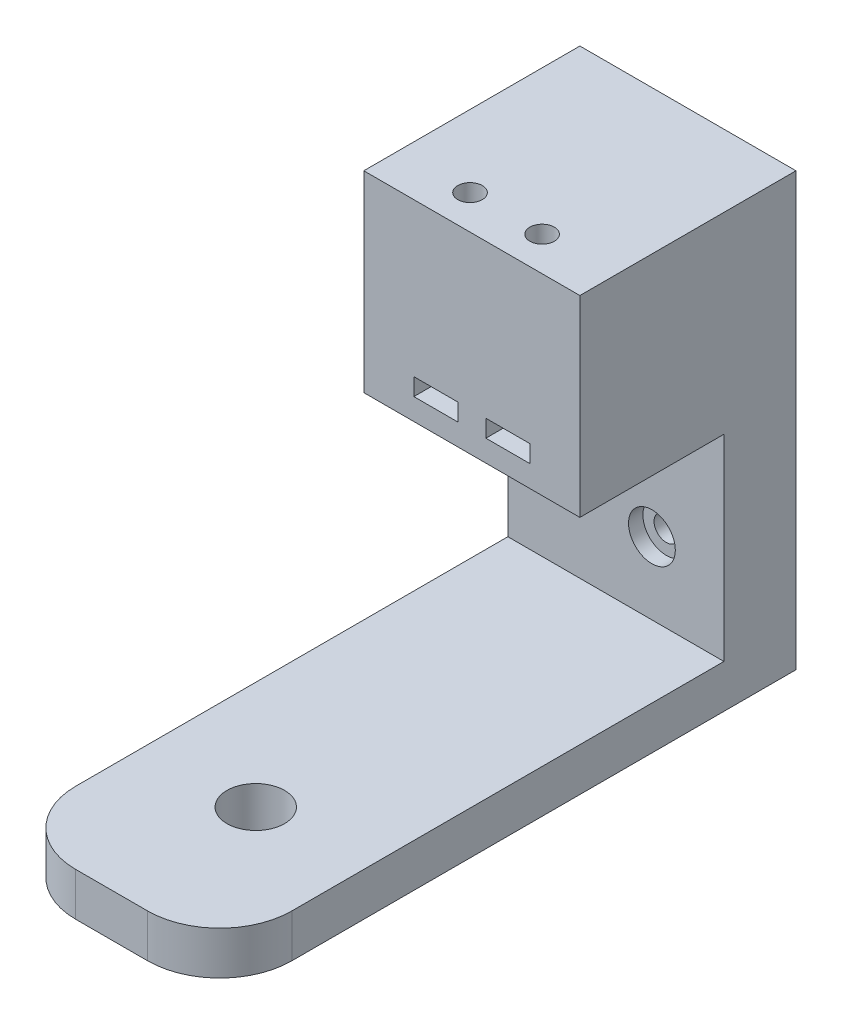
ISO-10303-21;
HEADER;
FILE_DESCRIPTION(('STEP AP214'),'2;1');
FILE_NAME('part.step','',(''),(''),'','','');
FILE_SCHEMA(('AUTOMOTIVE_DESIGN { 1 0 10303 214 1 1 1 1 }'));
ENDSEC;
DATA;
#1=APPLICATION_CONTEXT('core data for automotive mechanical design processes');
#2=APPLICATION_PROTOCOL_DEFINITION('international standard','automotive_design',2000,#1);
#3=PRODUCT_CONTEXT('',#1,'mechanical');
#4=PRODUCT('Part','Part','',(#3));
#5=PRODUCT_RELATED_PRODUCT_CATEGORY('part','',(#4));
#6=PRODUCT_DEFINITION_FORMATION('','',#4);
#7=PRODUCT_DEFINITION_CONTEXT('part definition',#1,'design');
#8=PRODUCT_DEFINITION('design','',#6,#7);
#9=PRODUCT_DEFINITION_SHAPE('','',#8);
#10=(LENGTH_UNIT() NAMED_UNIT(*) SI_UNIT(.MILLI.,.METRE.));
#11=(NAMED_UNIT(*) PLANE_ANGLE_UNIT() SI_UNIT($,.RADIAN.));
#12=(NAMED_UNIT(*) SI_UNIT($,.STERADIAN.) SOLID_ANGLE_UNIT());
#13=UNCERTAINTY_MEASURE_WITH_UNIT(LENGTH_MEASURE(1.E-05),#10,'distance_accuracy_value','');
#14=(GEOMETRIC_REPRESENTATION_CONTEXT(3) GLOBAL_UNCERTAINTY_ASSIGNED_CONTEXT((#13)) GLOBAL_UNIT_ASSIGNED_CONTEXT((#10,
#11,#12)) REPRESENTATION_CONTEXT('',''));
#15=CARTESIAN_POINT('',(0.,0.,0.));
#16=DIRECTION('',(0.,0.,1.));
#17=DIRECTION('',(1.,0.,0.));
#18=AXIS2_PLACEMENT_3D('',#15,#16,#17);
#19=CARTESIAN_POINT('',(20.,33.32,25.25));
#20=DIRECTION('',(0.,-1.,0.));
#21=DIRECTION('',(0.,0.,-1.));
#22=AXIS2_PLACEMENT_3D('',#19,#20,#21);
#23=CYLINDRICAL_SURFACE('',#22,1.7);
#24=CARTESIAN_POINT('',(20.,36.32,25.25));
#25=DIRECTION('',(0.,-1.,0.));
#26=DIRECTION('',(0.,0.,-1.));
#27=AXIS2_PLACEMENT_3D('',#24,#25,#26);
#28=CIRCLE('',#27,1.7);
#29=CARTESIAN_POINT('',(20.,36.32,23.55));
#30=VERTEX_POINT('',#29);
#31=EDGE_CURVE('E42',#30,#30,#28,.F.);
#32=ORIENTED_EDGE('',*,*,#31,.T.);
#33=EDGE_LOOP('',(#32));
#34=FACE_BOUND('',#33,.T.);
#35=CARTESIAN_POINT('',(20.,33.32,25.25));
#36=DIRECTION('',(0.,-1.,0.));
#37=DIRECTION('',(0.,0.,-1.));
#38=AXIS2_PLACEMENT_3D('',#35,#36,#37);
#39=CIRCLE('',#38,1.7);
#40=CARTESIAN_POINT('',(20.,33.32,23.55));
#41=VERTEX_POINT('',#40);
#42=EDGE_CURVE('E296',#41,#41,#39,.T.);
#43=ORIENTED_EDGE('',*,*,#42,.T.);
#44=EDGE_LOOP('',(#43));
#45=FACE_BOUND('',#44,.T.);
#46=ADVANCED_FACE('F38',(#34,#45),#23,.F.);
#47=CARTESIAN_POINT('',(10.,33.32,25.25));
#48=DIRECTION('',(0.,-1.,0.));
#49=DIRECTION('',(0.,0.,-1.));
#50=AXIS2_PLACEMENT_3D('',#47,#48,#49);
#51=CYLINDRICAL_SURFACE('',#50,1.7);
#52=CARTESIAN_POINT('',(10.,38.72,25.25));
#53=DIRECTION('',(0.,1.,0.));
#54=DIRECTION('',(0.,0.,1.));
#55=AXIS2_PLACEMENT_3D('',#52,#53,#54);
#56=CIRCLE('',#55,1.7);
#57=CARTESIAN_POINT('',(10.,38.72,26.95));
#58=VERTEX_POINT('',#57);
#59=EDGE_CURVE('E419',#58,#58,#56,.F.);
#60=ORIENTED_EDGE('',*,*,#59,.T.);
#61=EDGE_LOOP('',(#60));
#62=FACE_BOUND('',#61,.T.);
#63=CARTESIAN_POINT('',(10.,60.,25.25));
#64=DIRECTION('',(0.,-1.,0.));
#65=DIRECTION('',(0.,0.,-1.));
#66=AXIS2_PLACEMENT_3D('',#63,#64,#65);
#67=CIRCLE('',#66,1.7);
#68=CARTESIAN_POINT('',(10.,60.,23.55));
#69=VERTEX_POINT('',#68);
#70=EDGE_CURVE('E292',#69,#69,#67,.F.);
#71=ORIENTED_EDGE('',*,*,#70,.T.);
#72=EDGE_LOOP('',(#71));
#73=FACE_BOUND('',#72,.T.);
#74=ADVANCED_FACE('F450',(#62,#73),#51,.F.);
#75=CARTESIAN_POINT('',(0.,0.,0.));
#76=DIRECTION('',(0.,0.,-1.));
#77=DIRECTION('',(-1.,0.,0.));
#78=AXIS2_PLACEMENT_3D('',#75,#76,#77);
#79=PLANE('',#78);
#80=CARTESIAN_POINT('',(20.,16.,0.));
#81=DIRECTION('',(0.,0.,-1.));
#82=DIRECTION('',(-1.,0.,0.));
#83=AXIS2_PLACEMENT_3D('',#80,#81,#82);
#84=CIRCLE('',#83,1.7);
#85=CARTESIAN_POINT('',(18.3,16.,0.));
#86=VERTEX_POINT('',#85);
#87=EDGE_CURVE('E281',#86,#86,#84,.F.);
#88=ORIENTED_EDGE('',*,*,#87,.T.);
#89=EDGE_LOOP('',(#88));
#90=FACE_BOUND('',#89,.T.);
#91=DIRECTION('',(0.,-1.,0.));
#92=VECTOR('',#91,1.);
#93=CARTESIAN_POINT('',(0.,0.,0.));
#94=LINE('',#93,#92);
#95=CARTESIAN_POINT('',(0.,60.,0.));
#96=VERTEX_POINT('',#95);
#97=CARTESIAN_POINT('',(0.,0.,0.));
#98=VERTEX_POINT('',#97);
#99=EDGE_CURVE('E359',#96,#98,#94,.T.);
#100=ORIENTED_EDGE('',*,*,#99,.F.);
#101=DIRECTION('',(-1.,0.,0.));
#102=VECTOR('',#101,1.);
#103=CARTESIAN_POINT('',(0.,60.,0.));
#104=LINE('',#103,#102);
#105=CARTESIAN_POINT('',(30.,60.,0.));
#106=VERTEX_POINT('',#105);
#107=EDGE_CURVE('E365',#106,#96,#104,.T.);
#108=ORIENTED_EDGE('',*,*,#107,.F.);
#109=DIRECTION('',(0.,1.,0.));
#110=VECTOR('',#109,1.);
#111=CARTESIAN_POINT('',(30.,0.,0.));
#112=LINE('',#111,#110);
#113=CARTESIAN_POINT('',(30.,0.,0.));
#114=VERTEX_POINT('',#113);
#115=EDGE_CURVE('E376',#114,#106,#112,.T.);
#116=ORIENTED_EDGE('',*,*,#115,.F.);
#117=DIRECTION('',(1.,0.,0.));
#118=VECTOR('',#117,1.);
#119=CARTESIAN_POINT('',(0.,0.,0.));
#120=LINE('',#119,#118);
#121=EDGE_CURVE('E372',#98,#114,#120,.T.);
#122=ORIENTED_EDGE('',*,*,#121,.F.);
#123=EDGE_LOOP('',(#100,#108,#116,#122));
#124=FACE_BOUND('',#123,.T.);
#125=CARTESIAN_POINT('',(10.,23.32,0.));
#126=DIRECTION('',(0.,0.,-1.));
#127=DIRECTION('',(-1.,0.,0.));
#128=AXIS2_PLACEMENT_3D('',#125,#126,#127);
#129=CIRCLE('',#128,1.7);
#130=CARTESIAN_POINT('',(8.3,23.32,0.));
#131=VERTEX_POINT('',#130);
#132=EDGE_CURVE('E264',#131,#131,#129,.F.);
#133=ORIENTED_EDGE('',*,*,#132,.T.);
#134=EDGE_LOOP('',(#133));
#135=FACE_BOUND('',#134,.T.);
#136=ADVANCED_FACE('F456',(#90,#124,#135),#79,.T.);
#137=CARTESIAN_POINT('',(0.,60.,10.));
#138=DIRECTION('',(0.,-1.,0.));
#139=DIRECTION('',(0.,0.,-1.));
#140=AXIS2_PLACEMENT_3D('',#137,#138,#139);
#141=PLANE('',#140);
#142=ORIENTED_EDGE('',*,*,#107,.T.);
#143=DIRECTION('',(0.,0.,-1.));
#144=VECTOR('',#143,1.);
#145=CARTESIAN_POINT('',(0.,60.,10.));
#146=LINE('',#145,#144);
#147=CARTESIAN_POINT('',(0.,60.,30.));
#148=VERTEX_POINT('',#147);
#149=EDGE_CURVE('E368',#148,#96,#146,.T.);
#150=ORIENTED_EDGE('',*,*,#149,.F.);
#151=DIRECTION('',(-1.,0.,0.));
#152=VECTOR('',#151,1.);
#153=CARTESIAN_POINT('',(30.,60.,30.));
#154=LINE('',#153,#152);
#155=CARTESIAN_POINT('',(30.,60.,30.));
#156=VERTEX_POINT('',#155);
#157=EDGE_CURVE('E308',#156,#148,#154,.T.);
#158=ORIENTED_EDGE('',*,*,#157,.F.);
#159=DIRECTION('',(0.,0.,-1.));
#160=VECTOR('',#159,1.);
#161=CARTESIAN_POINT('',(30.,60.,10.));
#162=LINE('',#161,#160);
#163=EDGE_CURVE('E384',#156,#106,#162,.T.);
#164=ORIENTED_EDGE('',*,*,#163,.T.);
#165=EDGE_LOOP('',(#142,#150,#158,#164));
#166=FACE_BOUND('',#165,.T.);
#167=CARTESIAN_POINT('',(20.,60.,25.25));
#168=DIRECTION('',(0.,-1.,0.));
#169=DIRECTION('',(0.,0.,-1.));
#170=AXIS2_PLACEMENT_3D('',#167,#168,#169);
#171=CIRCLE('',#170,1.7);
#172=CARTESIAN_POINT('',(20.,60.,23.55));
#173=VERTEX_POINT('',#172);
#174=EDGE_CURVE('E300',#173,#173,#171,.F.);
#175=ORIENTED_EDGE('',*,*,#174,.F.);
#176=EDGE_LOOP('',(#175));
#177=FACE_BOUND('',#176,.T.);
#178=ORIENTED_EDGE('',*,*,#70,.F.);
#179=EDGE_LOOP('',(#178));
#180=FACE_BOUND('',#179,.T.);
#181=ADVANCED_FACE('F474',(#166,#177,#180),#141,.F.);
#182=CARTESIAN_POINT('',(0.,0.,10.));
#183=DIRECTION('',(0.,0.,-1.));
#184=DIRECTION('',(-1.,0.,0.));
#185=AXIS2_PLACEMENT_3D('',#182,#183,#184);
#186=PLANE('',#185);
#187=CARTESIAN_POINT('',(10.,23.32,10.));
#188=DIRECTION('',(0.,0.,1.));
#189=DIRECTION('',(1.,0.,0.));
#190=AXIS2_PLACEMENT_3D('',#187,#188,#189);
#191=CIRCLE('',#190,3.25);
#192=CARTESIAN_POINT('',(13.25,23.32,10.));
#193=VERTEX_POINT('',#192);
#194=EDGE_CURVE('E269',#193,#193,#191,.T.);
#195=ORIENTED_EDGE('',*,*,#194,.F.);
#196=EDGE_LOOP('',(#195));
#197=FACE_BOUND('',#196,.T.);
#198=CARTESIAN_POINT('',(20.,16.,10.));
#199=DIRECTION('',(0.,0.,1.));
#200=DIRECTION('',(1.,0.,0.));
#201=AXIS2_PLACEMENT_3D('',#198,#199,#200);
#202=CIRCLE('',#201,3.25);
#203=CARTESIAN_POINT('',(23.25,16.,10.));
#204=VERTEX_POINT('',#203);
#205=EDGE_CURVE('E268',#204,#204,#202,.T.);
#206=ORIENTED_EDGE('',*,*,#205,.F.);
#207=EDGE_LOOP('',(#206));
#208=FACE_BOUND('',#207,.T.);
#209=DIRECTION('',(1.,0.,0.));
#210=VECTOR('',#209,1.);
#211=CARTESIAN_POINT('',(0.,33.32,10.));
#212=LINE('',#211,#210);
#213=CARTESIAN_POINT('',(0.,33.32,10.));
#214=VERTEX_POINT('',#213);
#215=CARTESIAN_POINT('',(30.,33.32,10.));
#216=VERTEX_POINT('',#215);
#217=EDGE_CURVE('E304',#214,#216,#212,.T.);
#218=ORIENTED_EDGE('',*,*,#217,.F.);
#219=DIRECTION('',(0.,-1.,0.));
#220=VECTOR('',#219,1.);
#221=CARTESIAN_POINT('',(0.,0.,10.));
#222=LINE('',#221,#220);
#223=CARTESIAN_POINT('',(0.,6.,10.));
#224=VERTEX_POINT('',#223);
#225=EDGE_CURVE('E360',#214,#224,#222,.T.);
#226=ORIENTED_EDGE('',*,*,#225,.T.);
#227=DIRECTION('',(-1.,0.,0.));
#228=VECTOR('',#227,1.);
#229=CARTESIAN_POINT('',(0.,6.,10.));
#230=LINE('',#229,#228);
#231=CARTESIAN_POINT('',(30.,6.,10.));
#232=VERTEX_POINT('',#231);
#233=EDGE_CURVE('E341',#232,#224,#230,.T.);
#234=ORIENTED_EDGE('',*,*,#233,.F.);
#235=DIRECTION('',(0.,1.,0.));
#236=VECTOR('',#235,1.);
#237=CARTESIAN_POINT('',(30.,0.,10.));
#238=LINE('',#237,#236);
#239=EDGE_CURVE('E364',#232,#216,#238,.T.);
#240=ORIENTED_EDGE('',*,*,#239,.T.);
#241=EDGE_LOOP('',(#218,#226,#234,#240));
#242=FACE_BOUND('',#241,.T.);
#243=ADVANCED_FACE('F477',(#197,#208,#242),#186,.F.);
#244=CARTESIAN_POINT('',(0.,0.,10.));
#245=DIRECTION('',(1.,0.,0.));
#246=DIRECTION('',(0.,0.,-1.));
#247=AXIS2_PLACEMENT_3D('',#244,#245,#246);
#248=PLANE('',#247);
#249=DIRECTION('',(0.,0.,-1.));
#250=VECTOR('',#249,1.);
#251=CARTESIAN_POINT('',(0.,0.,10.));
#252=LINE('',#251,#250);
#253=CARTESIAN_POINT('',(0.,0.,70.));
#254=VERTEX_POINT('',#253);
#255=EDGE_CURVE('E391',#254,#98,#252,.T.);
#256=ORIENTED_EDGE('',*,*,#255,.F.);
#257=DIRECTION('',(0.,-1.,0.));
#258=VECTOR('',#257,1.);
#259=CARTESIAN_POINT('',(0.,6.,70.));
#260=LINE('',#259,#258);
#261=CARTESIAN_POINT('',(0.,6.,70.));
#262=VERTEX_POINT('',#261);
#263=EDGE_CURVE('E11',#254,#262,#260,.F.);
#264=ORIENTED_EDGE('',*,*,#263,.T.);
#265=DIRECTION('',(0.,0.,-1.));
#266=VECTOR('',#265,1.);
#267=CARTESIAN_POINT('',(0.,6.,80.));
#268=LINE('',#267,#266);
#269=EDGE_CURVE('E350',#262,#224,#268,.T.);
#270=ORIENTED_EDGE('',*,*,#269,.T.);
#271=ORIENTED_EDGE('',*,*,#225,.F.);
#272=DIRECTION('',(0.,0.,-1.));
#273=VECTOR('',#272,1.);
#274=CARTESIAN_POINT('',(0.,33.32,30.));
#275=LINE('',#274,#273);
#276=CARTESIAN_POINT('',(0.,33.32,30.));
#277=VERTEX_POINT('',#276);
#278=EDGE_CURVE('E329',#277,#214,#275,.T.);
#279=ORIENTED_EDGE('',*,*,#278,.F.);
#280=DIRECTION('',(0.,-1.,0.));
#281=VECTOR('',#280,1.);
#282=CARTESIAN_POINT('',(0.,60.,30.));
#283=LINE('',#282,#281);
#284=EDGE_CURVE('E312',#148,#277,#283,.T.);
#285=ORIENTED_EDGE('',*,*,#284,.F.);
#286=ORIENTED_EDGE('',*,*,#149,.T.);
#287=ORIENTED_EDGE('',*,*,#99,.T.);
#288=EDGE_LOOP('',(#256,#264,#270,#271,#279,#285,#286,#287));
#289=FACE_BOUND('',#288,.T.);
#290=ADVANCED_FACE('F486',(#289),#248,.F.);
#291=CARTESIAN_POINT('',(0.,0.,10.));
#292=DIRECTION('',(0.,1.,0.));
#293=DIRECTION('',(0.,0.,1.));
#294=AXIS2_PLACEMENT_3D('',#291,#292,#293);
#295=PLANE('',#294);
#296=CARTESIAN_POINT('',(15.,0.,60.));
#297=DIRECTION('',(0.,-1.,0.));
#298=DIRECTION('',(0.,0.,-1.));
#299=AXIS2_PLACEMENT_3D('',#296,#297,#298);
#300=CIRCLE('',#299,4.);
#301=CARTESIAN_POINT('',(15.,0.,56.));
#302=VERTEX_POINT('',#301);
#303=EDGE_CURVE('E333',#302,#302,#300,.T.);
#304=ORIENTED_EDGE('',*,*,#303,.F.);
#305=EDGE_LOOP('',(#304));
#306=FACE_BOUND('',#305,.T.);
#307=DIRECTION('',(0.,0.,-1.));
#308=VECTOR('',#307,1.);
#309=CARTESIAN_POINT('',(30.,0.,10.));
#310=LINE('',#309,#308);
#311=CARTESIAN_POINT('',(30.,0.,70.));
#312=VERTEX_POINT('',#311);
#313=EDGE_CURVE('E388',#312,#114,#310,.T.);
#314=ORIENTED_EDGE('',*,*,#313,.F.);
#315=CARTESIAN_POINT('',(20.,0.,70.));
#316=DIRECTION('',(0.,1.,0.));
#317=DIRECTION('',(0.,0.,1.));
#318=AXIS2_PLACEMENT_3D('',#315,#316,#317);
#319=CIRCLE('',#318,10.);
#320=CARTESIAN_POINT('',(20.,0.,80.));
#321=VERTEX_POINT('',#320);
#322=EDGE_CURVE('E48',#312,#321,#319,.F.);
#323=ORIENTED_EDGE('',*,*,#322,.T.);
#324=DIRECTION('',(1.,0.,0.));
#325=VECTOR('',#324,1.);
#326=CARTESIAN_POINT('',(0.,0.,80.));
#327=LINE('',#326,#325);
#328=CARTESIAN_POINT('',(10.,0.,80.));
#329=VERTEX_POINT('',#328);
#330=EDGE_CURVE('E342',#329,#321,#327,.T.);
#331=ORIENTED_EDGE('',*,*,#330,.F.);
#332=CARTESIAN_POINT('',(10.,0.,70.));
#333=DIRECTION('',(0.,1.,0.));
#334=DIRECTION('',(0.,0.,1.));
#335=AXIS2_PLACEMENT_3D('',#332,#333,#334);
#336=CIRCLE('',#335,10.);
#337=EDGE_CURVE('E411',#329,#254,#336,.F.);
#338=ORIENTED_EDGE('',*,*,#337,.T.);
#339=ORIENTED_EDGE('',*,*,#255,.T.);
#340=ORIENTED_EDGE('',*,*,#121,.T.);
#341=EDGE_LOOP('',(#314,#323,#331,#338,#339,#340));
#342=FACE_BOUND('',#341,.T.);
#343=ADVANCED_FACE('F496',(#306,#342),#295,.F.);
#344=CARTESIAN_POINT('',(30.,0.,10.));
#345=DIRECTION('',(-1.,0.,0.));
#346=DIRECTION('',(0.,0.,1.));
#347=AXIS2_PLACEMENT_3D('',#344,#345,#346);
#348=PLANE('',#347);
#349=DIRECTION('',(0.,0.,-1.));
#350=VECTOR('',#349,1.);
#351=CARTESIAN_POINT('',(30.,6.,80.));
#352=LINE('',#351,#350);
#353=CARTESIAN_POINT('',(30.,6.,70.));
#354=VERTEX_POINT('',#353);
#355=EDGE_CURVE('E356',#354,#232,#352,.T.);
#356=ORIENTED_EDGE('',*,*,#355,.F.);
#357=DIRECTION('',(0.,1.,0.));
#358=VECTOR('',#357,1.);
#359=CARTESIAN_POINT('',(30.,0.,70.));
#360=LINE('',#359,#358);
#361=EDGE_CURVE('E408',#354,#312,#360,.F.);
#362=ORIENTED_EDGE('',*,*,#361,.T.);
#363=ORIENTED_EDGE('',*,*,#313,.T.);
#364=ORIENTED_EDGE('',*,*,#115,.T.);
#365=ORIENTED_EDGE('',*,*,#163,.F.);
#366=DIRECTION('',(0.,1.,0.));
#367=VECTOR('',#366,1.);
#368=CARTESIAN_POINT('',(30.,33.32,30.));
#369=LINE('',#368,#367);
#370=CARTESIAN_POINT('',(30.,33.32,30.));
#371=VERTEX_POINT('',#370);
#372=EDGE_CURVE('E318',#371,#156,#369,.T.);
#373=ORIENTED_EDGE('',*,*,#372,.F.);
#374=DIRECTION('',(0.,0.,-1.));
#375=VECTOR('',#374,1.);
#376=CARTESIAN_POINT('',(30.,33.32,30.));
#377=LINE('',#376,#375);
#378=EDGE_CURVE('E322',#371,#216,#377,.T.);
#379=ORIENTED_EDGE('',*,*,#378,.T.);
#380=ORIENTED_EDGE('',*,*,#239,.F.);
#381=EDGE_LOOP('',(#356,#362,#363,#364,#365,#373,#379,#380));
#382=FACE_BOUND('',#381,.T.);
#383=ADVANCED_FACE('F492',(#382),#348,.F.);
#384=CARTESIAN_POINT('',(0.,6.,80.));
#385=DIRECTION('',(0.,-1.,0.));
#386=DIRECTION('',(0.,0.,-1.));
#387=AXIS2_PLACEMENT_3D('',#384,#385,#386);
#388=PLANE('',#387);
#389=CARTESIAN_POINT('',(15.,6.,60.));
#390=DIRECTION('',(0.,-1.,0.));
#391=DIRECTION('',(0.,0.,-1.));
#392=AXIS2_PLACEMENT_3D('',#389,#390,#391);
#393=CIRCLE('',#392,4.);
#394=CARTESIAN_POINT('',(15.,6.,56.));
#395=VERTEX_POINT('',#394);
#396=EDGE_CURVE('E337',#395,#395,#393,.F.);
#397=ORIENTED_EDGE('',*,*,#396,.F.);
#398=EDGE_LOOP('',(#397));
#399=FACE_BOUND('',#398,.T.);
#400=DIRECTION('',(-1.,0.,0.));
#401=VECTOR('',#400,1.);
#402=CARTESIAN_POINT('',(0.,6.,80.));
#403=LINE('',#402,#401);
#404=CARTESIAN_POINT('',(20.,6.,80.));
#405=VERTEX_POINT('',#404);
#406=CARTESIAN_POINT('',(10.,6.,80.));
#407=VERTEX_POINT('',#406);
#408=EDGE_CURVE('E346',#405,#407,#403,.T.);
#409=ORIENTED_EDGE('',*,*,#408,.F.);
#410=CARTESIAN_POINT('',(20.,6.,70.));
#411=DIRECTION('',(0.,-1.,0.));
#412=DIRECTION('',(0.,0.,-1.));
#413=AXIS2_PLACEMENT_3D('',#410,#411,#412);
#414=CIRCLE('',#413,10.);
#415=EDGE_CURVE('E405',#405,#354,#414,.F.);
#416=ORIENTED_EDGE('',*,*,#415,.T.);
#417=ORIENTED_EDGE('',*,*,#355,.T.);
#418=ORIENTED_EDGE('',*,*,#233,.T.);
#419=ORIENTED_EDGE('',*,*,#269,.F.);
#420=CARTESIAN_POINT('',(10.,6.,70.));
#421=DIRECTION('',(0.,-1.,0.));
#422=DIRECTION('',(0.,0.,-1.));
#423=AXIS2_PLACEMENT_3D('',#420,#421,#422);
#424=CIRCLE('',#423,10.);
#425=EDGE_CURVE('E402',#262,#407,#424,.F.);
#426=ORIENTED_EDGE('',*,*,#425,.T.);
#427=EDGE_LOOP('',(#409,#416,#417,#418,#419,#426));
#428=FACE_BOUND('',#427,.T.);
#429=ADVANCED_FACE('F495',(#399,#428),#388,.F.);
#430=CARTESIAN_POINT('',(0.,0.,80.));
#431=DIRECTION('',(0.,0.,1.));
#432=DIRECTION('',(1.,0.,0.));
#433=AXIS2_PLACEMENT_3D('',#430,#431,#432);
#434=PLANE('',#433);
#435=ORIENTED_EDGE('',*,*,#330,.T.);
#436=DIRECTION('',(0.,1.,0.));
#437=VECTOR('',#436,1.);
#438=CARTESIAN_POINT('',(20.,6.,80.));
#439=LINE('',#438,#437);
#440=EDGE_CURVE('E398',#321,#405,#439,.T.);
#441=ORIENTED_EDGE('',*,*,#440,.T.);
#442=ORIENTED_EDGE('',*,*,#408,.T.);
#443=DIRECTION('',(0.,-1.,0.));
#444=VECTOR('',#443,1.);
#445=CARTESIAN_POINT('',(10.,0.,80.));
#446=LINE('',#445,#444);
#447=EDGE_CURVE('E394',#407,#329,#446,.T.);
#448=ORIENTED_EDGE('',*,*,#447,.T.);
#449=EDGE_LOOP('',(#435,#441,#442,#448));
#450=FACE_BOUND('',#449,.T.);
#451=ADVANCED_FACE('F523',(#450),#434,.T.);
#452=CARTESIAN_POINT('',(15.,17.3137084989848,60.));
#453=DIRECTION('',(0.,-1.,0.));
#454=DIRECTION('',(0.,0.,-1.));
#455=AXIS2_PLACEMENT_3D('',#452,#453,#454);
#456=CYLINDRICAL_SURFACE('',#455,4.);
#457=ORIENTED_EDGE('',*,*,#396,.T.);
#458=EDGE_LOOP('',(#457));
#459=FACE_BOUND('',#458,.T.);
#460=ORIENTED_EDGE('',*,*,#303,.T.);
#461=EDGE_LOOP('',(#460));
#462=FACE_BOUND('',#461,.T.);
#463=ADVANCED_FACE('F556',(#459,#462),#456,.F.);
#464=CARTESIAN_POINT('',(0.,33.32,30.));
#465=DIRECTION('',(0.,1.,0.));
#466=DIRECTION('',(0.,0.,1.));
#467=AXIS2_PLACEMENT_3D('',#464,#465,#466);
#468=PLANE('',#467);
#469=CARTESIAN_POINT('',(10.,33.32,25.25));
#470=DIRECTION('',(0.,-1.,0.));
#471=DIRECTION('',(0.,0.,-1.));
#472=AXIS2_PLACEMENT_3D('',#469,#470,#471);
#473=CIRCLE('',#472,1.7);
#474=CARTESIAN_POINT('',(10.,33.32,23.55));
#475=VERTEX_POINT('',#474);
#476=EDGE_CURVE('E285',#475,#475,#473,.T.);
#477=ORIENTED_EDGE('',*,*,#476,.F.);
#478=EDGE_LOOP('',(#477));
#479=FACE_BOUND('',#478,.T.);
#480=ORIENTED_EDGE('',*,*,#42,.F.);
#481=EDGE_LOOP('',(#480));
#482=FACE_BOUND('',#481,.T.);
#483=ORIENTED_EDGE('',*,*,#217,.T.);
#484=ORIENTED_EDGE('',*,*,#378,.F.);
#485=DIRECTION('',(1.,0.,0.));
#486=VECTOR('',#485,1.);
#487=CARTESIAN_POINT('',(0.,33.32,30.));
#488=LINE('',#487,#486);
#489=EDGE_CURVE('E315',#277,#371,#488,.T.);
#490=ORIENTED_EDGE('',*,*,#489,.F.);
#491=ORIENTED_EDGE('',*,*,#278,.T.);
#492=EDGE_LOOP('',(#483,#484,#490,#491));
#493=FACE_BOUND('',#492,.T.);
#494=ADVANCED_FACE('F469',(#479,#482,#493),#468,.F.);
#495=CARTESIAN_POINT('',(0.,0.,30.));
#496=DIRECTION('',(0.,0.,1.));
#497=DIRECTION('',(1.,0.,0.));
#498=AXIS2_PLACEMENT_3D('',#495,#496,#497);
#499=PLANE('',#498);
#500=DIRECTION('',(0.,-1.,0.));
#501=VECTOR('',#500,1.);
#502=CARTESIAN_POINT('',(6.95,38.72,30.));
#503=LINE('',#502,#501);
#504=CARTESIAN_POINT('',(6.95,38.72,30.));
#505=VERTEX_POINT('',#504);
#506=CARTESIAN_POINT('',(6.95,36.32,30.));
#507=VERTEX_POINT('',#506);
#508=EDGE_CURVE('E56',#505,#507,#503,.T.);
#509=ORIENTED_EDGE('',*,*,#508,.F.);
#510=DIRECTION('',(-1.,0.,0.));
#511=VECTOR('',#510,1.);
#512=CARTESIAN_POINT('',(6.95,38.72,30.));
#513=LINE('',#512,#511);
#514=CARTESIAN_POINT('',(13.05,38.72,30.));
#515=VERTEX_POINT('',#514);
#516=EDGE_CURVE('E189',#515,#505,#513,.T.);
#517=ORIENTED_EDGE('',*,*,#516,.F.);
#518=DIRECTION('',(0.,1.,0.));
#519=VECTOR('',#518,1.);
#520=CARTESIAN_POINT('',(13.05,38.72,30.));
#521=LINE('',#520,#519);
#522=CARTESIAN_POINT('',(13.05,36.32,30.));
#523=VERTEX_POINT('',#522);
#524=EDGE_CURVE('E193',#523,#515,#521,.T.);
#525=ORIENTED_EDGE('',*,*,#524,.F.);
#526=DIRECTION('',(1.,0.,0.));
#527=VECTOR('',#526,1.);
#528=CARTESIAN_POINT('',(6.95,36.32,30.));
#529=LINE('',#528,#527);
#530=EDGE_CURVE('E202',#507,#523,#529,.T.);
#531=ORIENTED_EDGE('',*,*,#530,.F.);
#532=EDGE_LOOP('',(#509,#517,#525,#531));
#533=FACE_BOUND('',#532,.T.);
#534=DIRECTION('',(0.,1.,0.));
#535=VECTOR('',#534,1.);
#536=CARTESIAN_POINT('',(23.05,38.72,30.));
#537=LINE('',#536,#535);
#538=CARTESIAN_POINT('',(23.05,36.32,30.));
#539=VERTEX_POINT('',#538);
#540=CARTESIAN_POINT('',(23.05,38.72,30.));
#541=VERTEX_POINT('',#540);
#542=EDGE_CURVE('E64',#539,#541,#537,.T.);
#543=ORIENTED_EDGE('',*,*,#542,.F.);
#544=DIRECTION('',(1.,0.,0.));
#545=VECTOR('',#544,1.);
#546=CARTESIAN_POINT('',(23.05,36.32,30.));
#547=LINE('',#546,#545);
#548=CARTESIAN_POINT('',(16.95,36.32,30.));
#549=VERTEX_POINT('',#548);
#550=EDGE_CURVE('E223',#549,#539,#547,.T.);
#551=ORIENTED_EDGE('',*,*,#550,.F.);
#552=DIRECTION('',(0.,-1.,0.));
#553=VECTOR('',#552,1.);
#554=CARTESIAN_POINT('',(16.95,38.72,30.));
#555=LINE('',#554,#553);
#556=CARTESIAN_POINT('',(16.95,38.72,30.));
#557=VERTEX_POINT('',#556);
#558=EDGE_CURVE('E242',#557,#549,#555,.T.);
#559=ORIENTED_EDGE('',*,*,#558,.F.);
#560=DIRECTION('',(-1.,0.,0.));
#561=VECTOR('',#560,1.);
#562=CARTESIAN_POINT('',(23.05,38.72,30.));
#563=LINE('',#562,#561);
#564=EDGE_CURVE('E238',#541,#557,#563,.T.);
#565=ORIENTED_EDGE('',*,*,#564,.F.);
#566=EDGE_LOOP('',(#543,#551,#559,#565));
#567=FACE_BOUND('',#566,.T.);
#568=ORIENTED_EDGE('',*,*,#157,.T.);
#569=ORIENTED_EDGE('',*,*,#284,.T.);
#570=ORIENTED_EDGE('',*,*,#489,.T.);
#571=ORIENTED_EDGE('',*,*,#372,.T.);
#572=EDGE_LOOP('',(#568,#569,#570,#571));
#573=FACE_BOUND('',#572,.T.);
#574=ADVANCED_FACE('F462',(#533,#567,#573),#499,.T.);
#575=CARTESIAN_POINT('',(20.,38.72,25.25));
#576=DIRECTION('',(0.,1.,0.));
#577=DIRECTION('',(0.,0.,1.));
#578=AXIS2_PLACEMENT_3D('',#575,#576,#577);
#579=CIRCLE('',#578,1.7);
#580=CARTESIAN_POINT('',(20.,38.72,26.95));
#581=VERTEX_POINT('',#580);
#582=EDGE_CURVE('E422',#581,#581,#579,.F.);
#583=ORIENTED_EDGE('',*,*,#582,.T.);
#584=EDGE_LOOP('',(#583));
#585=FACE_BOUND('',#584,.T.);
#586=ORIENTED_EDGE('',*,*,#174,.T.);
#587=EDGE_LOOP('',(#586));
#588=FACE_BOUND('',#587,.T.);
#589=ADVANCED_FACE('F452',(#585,#588),#23,.F.);
#590=CARTESIAN_POINT('',(10.,36.32,25.25));
#591=DIRECTION('',(0.,-1.,0.));
#592=DIRECTION('',(0.,0.,-1.));
#593=AXIS2_PLACEMENT_3D('',#590,#591,#592);
#594=CIRCLE('',#593,1.7);
#595=CARTESIAN_POINT('',(10.,36.32,23.55));
#596=VERTEX_POINT('',#595);
#597=EDGE_CURVE('E212',#596,#596,#594,.F.);
#598=ORIENTED_EDGE('',*,*,#597,.T.);
#599=EDGE_LOOP('',(#598));
#600=FACE_BOUND('',#599,.T.);
#601=ORIENTED_EDGE('',*,*,#476,.T.);
#602=EDGE_LOOP('',(#601));
#603=FACE_BOUND('',#602,.T.);
#604=ADVANCED_FACE('F459',(#600,#603),#51,.F.);
#605=CARTESIAN_POINT('',(20.,16.,10.));
#606=DIRECTION('',(0.,0.,1.));
#607=DIRECTION('',(1.,0.,0.));
#608=AXIS2_PLACEMENT_3D('',#605,#606,#607);
#609=CYLINDRICAL_SURFACE('',#608,1.7);
#610=ORIENTED_EDGE('',*,*,#87,.F.);
#611=EDGE_LOOP('',(#610));
#612=FACE_BOUND('',#611,.T.);
#613=CARTESIAN_POINT('',(20.,16.,8.));
#614=DIRECTION('',(0.,0.,1.));
#615=DIRECTION('',(1.,0.,0.));
#616=AXIS2_PLACEMENT_3D('',#613,#614,#615);
#617=CIRCLE('',#616,1.7);
#618=CARTESIAN_POINT('',(21.7,16.,8.));
#619=VERTEX_POINT('',#618);
#620=EDGE_CURVE('E276',#619,#619,#617,.T.);
#621=ORIENTED_EDGE('',*,*,#620,.T.);
#622=EDGE_LOOP('',(#621));
#623=FACE_BOUND('',#622,.T.);
#624=ADVANCED_FACE('F467',(#612,#623),#609,.F.);
#625=CARTESIAN_POINT('',(21.7,16.,8.));
#626=DIRECTION('',(0.,0.,-1.));
#627=DIRECTION('',(-1.,0.,0.));
#628=AXIS2_PLACEMENT_3D('',#625,#626,#627);
#629=PLANE('',#628);
#630=ORIENTED_EDGE('',*,*,#620,.F.);
#631=EDGE_LOOP('',(#630));
#632=FACE_BOUND('',#631,.T.);
#633=CARTESIAN_POINT('',(20.,16.,8.));
#634=DIRECTION('',(0.,0.,1.));
#635=DIRECTION('',(1.,0.,0.));
#636=AXIS2_PLACEMENT_3D('',#633,#634,#635);
#637=CIRCLE('',#636,3.25);
#638=CARTESIAN_POINT('',(23.25,16.,8.));
#639=VERTEX_POINT('',#638);
#640=EDGE_CURVE('E280',#639,#639,#637,.T.);
#641=ORIENTED_EDGE('',*,*,#640,.T.);
#642=EDGE_LOOP('',(#641));
#643=FACE_BOUND('',#642,.T.);
#644=ADVANCED_FACE('F695',(#632,#643),#629,.F.);
#645=CARTESIAN_POINT('',(20.,16.,10.));
#646=DIRECTION('',(0.,0.,1.));
#647=DIRECTION('',(1.,0.,0.));
#648=AXIS2_PLACEMENT_3D('',#645,#646,#647);
#649=CYLINDRICAL_SURFACE('',#648,3.25);
#650=ORIENTED_EDGE('',*,*,#640,.F.);
#651=EDGE_LOOP('',(#650));
#652=FACE_BOUND('',#651,.T.);
#653=ORIENTED_EDGE('',*,*,#205,.T.);
#654=EDGE_LOOP('',(#653));
#655=FACE_BOUND('',#654,.T.);
#656=ADVANCED_FACE('F689',(#652,#655),#649,.F.);
#657=CARTESIAN_POINT('',(10.,23.32,10.));
#658=DIRECTION('',(0.,0.,1.));
#659=DIRECTION('',(1.,0.,0.));
#660=AXIS2_PLACEMENT_3D('',#657,#658,#659);
#661=CYLINDRICAL_SURFACE('',#660,1.7);
#662=ORIENTED_EDGE('',*,*,#132,.F.);
#663=EDGE_LOOP('',(#662));
#664=FACE_BOUND('',#663,.T.);
#665=CARTESIAN_POINT('',(10.,23.32,8.));
#666=DIRECTION('',(0.,0.,1.));
#667=DIRECTION('',(1.,0.,0.));
#668=AXIS2_PLACEMENT_3D('',#665,#666,#667);
#669=CIRCLE('',#668,1.7);
#670=CARTESIAN_POINT('',(11.7,23.32,8.));
#671=VERTEX_POINT('',#670);
#672=EDGE_CURVE('E259',#671,#671,#669,.T.);
#673=ORIENTED_EDGE('',*,*,#672,.T.);
#674=EDGE_LOOP('',(#673));
#675=FACE_BOUND('',#674,.T.);
#676=ADVANCED_FACE('F686',(#664,#675),#661,.F.);
#677=CARTESIAN_POINT('',(11.7,23.32,8.));
#678=DIRECTION('',(0.,0.,-1.));
#679=DIRECTION('',(-1.,0.,0.));
#680=AXIS2_PLACEMENT_3D('',#677,#678,#679);
#681=PLANE('',#680);
#682=ORIENTED_EDGE('',*,*,#672,.F.);
#683=EDGE_LOOP('',(#682));
#684=FACE_BOUND('',#683,.T.);
#685=CARTESIAN_POINT('',(10.,23.32,8.));
#686=DIRECTION('',(0.,0.,1.));
#687=DIRECTION('',(1.,0.,0.));
#688=AXIS2_PLACEMENT_3D('',#685,#686,#687);
#689=CIRCLE('',#688,3.25);
#690=CARTESIAN_POINT('',(13.25,23.32,8.));
#691=VERTEX_POINT('',#690);
#692=EDGE_CURVE('E263',#691,#691,#689,.T.);
#693=ORIENTED_EDGE('',*,*,#692,.T.);
#694=EDGE_LOOP('',(#693));
#695=FACE_BOUND('',#694,.T.);
#696=ADVANCED_FACE('F513',(#684,#695),#681,.F.);
#697=CARTESIAN_POINT('',(10.,23.32,10.));
#698=DIRECTION('',(0.,0.,1.));
#699=DIRECTION('',(1.,0.,0.));
#700=AXIS2_PLACEMENT_3D('',#697,#698,#699);
#701=CYLINDRICAL_SURFACE('',#700,3.25);
#702=ORIENTED_EDGE('',*,*,#692,.F.);
#703=EDGE_LOOP('',(#702));
#704=FACE_BOUND('',#703,.T.);
#705=ORIENTED_EDGE('',*,*,#194,.T.);
#706=EDGE_LOOP('',(#705));
#707=FACE_BOUND('',#706,.T.);
#708=ADVANCED_FACE('F505',(#704,#707),#701,.F.);
#709=CARTESIAN_POINT('',(20.,0.,70.));
#710=DIRECTION('',(0.,-1.,0.));
#711=DIRECTION('',(0.,0.,-1.));
#712=AXIS2_PLACEMENT_3D('',#709,#710,#711);
#713=CYLINDRICAL_SURFACE('',#712,10.);
#714=ORIENTED_EDGE('',*,*,#322,.F.);
#715=ORIENTED_EDGE('',*,*,#361,.F.);
#716=ORIENTED_EDGE('',*,*,#415,.F.);
#717=ORIENTED_EDGE('',*,*,#440,.F.);
#718=EDGE_LOOP('',(#714,#715,#716,#717));
#719=FACE_BOUND('',#718,.T.);
#720=ADVANCED_FACE('F503',(#719),#713,.T.);
#721=CARTESIAN_POINT('',(10.,0.,70.));
#722=DIRECTION('',(0.,1.,0.));
#723=DIRECTION('',(0.,0.,1.));
#724=AXIS2_PLACEMENT_3D('',#721,#722,#723);
#725=CYLINDRICAL_SURFACE('',#724,10.);
#726=ORIENTED_EDGE('',*,*,#425,.F.);
#727=ORIENTED_EDGE('',*,*,#263,.F.);
#728=ORIENTED_EDGE('',*,*,#337,.F.);
#729=ORIENTED_EDGE('',*,*,#447,.F.);
#730=EDGE_LOOP('',(#726,#727,#728,#729));
#731=FACE_BOUND('',#730,.T.);
#732=ADVANCED_FACE('F40',(#731),#725,.T.);
#733=CARTESIAN_POINT('',(6.95,38.72,21.55));
#734=DIRECTION('',(0.,1.,0.));
#735=DIRECTION('',(0.,0.,1.));
#736=AXIS2_PLACEMENT_3D('',#733,#734,#735);
#737=PLANE('',#736);
#738=ORIENTED_EDGE('',*,*,#516,.T.);
#739=DIRECTION('',(0.,0.,1.));
#740=VECTOR('',#739,1.);
#741=CARTESIAN_POINT('',(6.95,38.72,21.55));
#742=LINE('',#741,#740);
#743=CARTESIAN_POINT('',(6.95,38.72,21.55));
#744=VERTEX_POINT('',#743);
#745=EDGE_CURVE('E209',#744,#505,#742,.T.);
#746=ORIENTED_EDGE('',*,*,#745,.F.);
#747=DIRECTION('',(-1.,0.,0.));
#748=VECTOR('',#747,1.);
#749=CARTESIAN_POINT('',(6.95,38.72,21.55));
#750=LINE('',#749,#748);
#751=CARTESIAN_POINT('',(13.05,38.72,21.55));
#752=VERTEX_POINT('',#751);
#753=EDGE_CURVE('E174',#752,#744,#750,.T.);
#754=ORIENTED_EDGE('',*,*,#753,.F.);
#755=DIRECTION('',(0.,0.,1.));
#756=VECTOR('',#755,1.);
#757=CARTESIAN_POINT('',(13.05,38.72,21.55));
#758=LINE('',#757,#756);
#759=EDGE_CURVE('E213',#752,#515,#758,.T.);
#760=ORIENTED_EDGE('',*,*,#759,.T.);
#761=EDGE_LOOP('',(#738,#746,#754,#760));
#762=FACE_BOUND('',#761,.T.);
#763=ORIENTED_EDGE('',*,*,#59,.F.);
#764=EDGE_LOOP('',(#763));
#765=FACE_BOUND('',#764,.T.);
#766=ADVANCED_FACE('F511',(#762,#765),#737,.F.);
#767=CARTESIAN_POINT('',(6.95,36.32,21.55));
#768=DIRECTION('',(0.,-1.,0.));
#769=DIRECTION('',(0.,0.,-1.));
#770=AXIS2_PLACEMENT_3D('',#767,#768,#769);
#771=PLANE('',#770);
#772=ORIENTED_EDGE('',*,*,#530,.T.);
#773=DIRECTION('',(0.,0.,1.));
#774=VECTOR('',#773,1.);
#775=CARTESIAN_POINT('',(13.05,36.32,21.55));
#776=LINE('',#775,#774);
#777=CARTESIAN_POINT('',(13.05,36.32,21.55));
#778=VERTEX_POINT('',#777);
#779=EDGE_CURVE('E173',#778,#523,#776,.T.);
#780=ORIENTED_EDGE('',*,*,#779,.F.);
#781=DIRECTION('',(1.,0.,0.));
#782=VECTOR('',#781,1.);
#783=CARTESIAN_POINT('',(6.95,36.32,21.55));
#784=LINE('',#783,#782);
#785=CARTESIAN_POINT('',(6.95,36.32,21.55));
#786=VERTEX_POINT('',#785);
#787=EDGE_CURVE('E177',#786,#778,#784,.T.);
#788=ORIENTED_EDGE('',*,*,#787,.F.);
#789=DIRECTION('',(0.,0.,1.));
#790=VECTOR('',#789,1.);
#791=CARTESIAN_POINT('',(6.95,36.32,21.55));
#792=LINE('',#791,#790);
#793=EDGE_CURVE('E163',#786,#507,#792,.T.);
#794=ORIENTED_EDGE('',*,*,#793,.T.);
#795=EDGE_LOOP('',(#772,#780,#788,#794));
#796=FACE_BOUND('',#795,.T.);
#797=ORIENTED_EDGE('',*,*,#597,.F.);
#798=EDGE_LOOP('',(#797));
#799=FACE_BOUND('',#798,.T.);
#800=ADVANCED_FACE('F178',(#796,#799),#771,.F.);
#801=CARTESIAN_POINT('',(6.95,38.72,21.55));
#802=DIRECTION('',(-1.,0.,0.));
#803=DIRECTION('',(0.,-1.,0.));
#804=AXIS2_PLACEMENT_3D('',#801,#802,#803);
#805=PLANE('',#804);
#806=ORIENTED_EDGE('',*,*,#508,.T.);
#807=ORIENTED_EDGE('',*,*,#793,.F.);
#808=DIRECTION('',(0.,-1.,0.));
#809=VECTOR('',#808,1.);
#810=CARTESIAN_POINT('',(6.95,38.72,21.55));
#811=LINE('',#810,#809);
#812=EDGE_CURVE('E167',#744,#786,#811,.T.);
#813=ORIENTED_EDGE('',*,*,#812,.F.);
#814=ORIENTED_EDGE('',*,*,#745,.T.);
#815=EDGE_LOOP('',(#806,#807,#813,#814));
#816=FACE_BOUND('',#815,.T.);
#817=ADVANCED_FACE('F165',(#816),#805,.F.);
#818=CARTESIAN_POINT('',(13.05,38.72,21.55));
#819=DIRECTION('',(1.,0.,0.));
#820=DIRECTION('',(0.,1.,0.));
#821=AXIS2_PLACEMENT_3D('',#818,#819,#820);
#822=PLANE('',#821);
#823=ORIENTED_EDGE('',*,*,#524,.T.);
#824=ORIENTED_EDGE('',*,*,#759,.F.);
#825=DIRECTION('',(0.,1.,0.));
#826=VECTOR('',#825,1.);
#827=CARTESIAN_POINT('',(13.05,38.72,21.55));
#828=LINE('',#827,#826);
#829=EDGE_CURVE('E184',#778,#752,#828,.T.);
#830=ORIENTED_EDGE('',*,*,#829,.F.);
#831=ORIENTED_EDGE('',*,*,#779,.T.);
#832=EDGE_LOOP('',(#823,#824,#830,#831));
#833=FACE_BOUND('',#832,.T.);
#834=ADVANCED_FACE('F445',(#833),#822,.F.);
#835=CARTESIAN_POINT('',(0.,0.,21.55));
#836=DIRECTION('',(0.,0.,1.));
#837=DIRECTION('',(1.,0.,0.));
#838=AXIS2_PLACEMENT_3D('',#835,#836,#837);
#839=PLANE('',#838);
#840=ORIENTED_EDGE('',*,*,#812,.T.);
#841=ORIENTED_EDGE('',*,*,#787,.T.);
#842=ORIENTED_EDGE('',*,*,#829,.T.);
#843=ORIENTED_EDGE('',*,*,#753,.T.);
#844=EDGE_LOOP('',(#840,#841,#842,#843));
#845=FACE_BOUND('',#844,.T.);
#846=ADVANCED_FACE('F186',(#845),#839,.T.);
#847=CARTESIAN_POINT('',(23.05,36.32,21.55));
#848=DIRECTION('',(0.,-1.,0.));
#849=DIRECTION('',(0.,0.,-1.));
#850=AXIS2_PLACEMENT_3D('',#847,#848,#849);
#851=PLANE('',#850);
#852=ORIENTED_EDGE('',*,*,#550,.T.);
#853=DIRECTION('',(0.,0.,1.));
#854=VECTOR('',#853,1.);
#855=CARTESIAN_POINT('',(23.05,36.32,21.55));
#856=LINE('',#855,#854);
#857=CARTESIAN_POINT('',(23.05,36.32,21.55));
#858=VERTEX_POINT('',#857);
#859=EDGE_CURVE('E203',#858,#539,#856,.T.);
#860=ORIENTED_EDGE('',*,*,#859,.F.);
#861=DIRECTION('',(1.,0.,0.));
#862=VECTOR('',#861,1.);
#863=CARTESIAN_POINT('',(23.05,36.32,21.55));
#864=LINE('',#863,#862);
#865=CARTESIAN_POINT('',(16.95,36.32,21.55));
#866=VERTEX_POINT('',#865);
#867=EDGE_CURVE('E231',#866,#858,#864,.T.);
#868=ORIENTED_EDGE('',*,*,#867,.F.);
#869=DIRECTION('',(0.,0.,1.));
#870=VECTOR('',#869,1.);
#871=CARTESIAN_POINT('',(16.95,36.32,21.55));
#872=LINE('',#871,#870);
#873=EDGE_CURVE('E251',#866,#549,#872,.T.);
#874=ORIENTED_EDGE('',*,*,#873,.T.);
#875=EDGE_LOOP('',(#852,#860,#868,#874));
#876=FACE_BOUND('',#875,.T.);
#877=ORIENTED_EDGE('',*,*,#31,.F.);
#878=EDGE_LOOP('',(#877));
#879=FACE_BOUND('',#878,.T.);
#880=ADVANCED_FACE('F433',(#876,#879),#851,.F.);
#881=CARTESIAN_POINT('',(23.05,38.72,21.55));
#882=DIRECTION('',(0.,1.,0.));
#883=DIRECTION('',(0.,0.,1.));
#884=AXIS2_PLACEMENT_3D('',#881,#882,#883);
#885=PLANE('',#884);
#886=ORIENTED_EDGE('',*,*,#564,.T.);
#887=DIRECTION('',(0.,0.,1.));
#888=VECTOR('',#887,1.);
#889=CARTESIAN_POINT('',(16.95,38.72,21.55));
#890=LINE('',#889,#888);
#891=CARTESIAN_POINT('',(16.95,38.72,21.55));
#892=VERTEX_POINT('',#891);
#893=EDGE_CURVE('E254',#892,#557,#890,.T.);
#894=ORIENTED_EDGE('',*,*,#893,.F.);
#895=DIRECTION('',(-1.,0.,0.));
#896=VECTOR('',#895,1.);
#897=CARTESIAN_POINT('',(23.05,38.72,21.55));
#898=LINE('',#897,#896);
#899=CARTESIAN_POINT('',(23.05,38.72,21.55));
#900=VERTEX_POINT('',#899);
#901=EDGE_CURVE('E222',#900,#892,#898,.T.);
#902=ORIENTED_EDGE('',*,*,#901,.F.);
#903=DIRECTION('',(0.,0.,1.));
#904=VECTOR('',#903,1.);
#905=CARTESIAN_POINT('',(23.05,38.72,21.55));
#906=LINE('',#905,#904);
#907=EDGE_CURVE('E235',#900,#541,#906,.T.);
#908=ORIENTED_EDGE('',*,*,#907,.T.);
#909=EDGE_LOOP('',(#886,#894,#902,#908));
#910=FACE_BOUND('',#909,.T.);
#911=ORIENTED_EDGE('',*,*,#582,.F.);
#912=EDGE_LOOP('',(#911));
#913=FACE_BOUND('',#912,.T.);
#914=ADVANCED_FACE('F435',(#910,#913),#885,.F.);
#915=CARTESIAN_POINT('',(23.05,38.72,21.55));
#916=DIRECTION('',(1.,0.,0.));
#917=DIRECTION('',(0.,1.,0.));
#918=AXIS2_PLACEMENT_3D('',#915,#916,#917);
#919=PLANE('',#918);
#920=ORIENTED_EDGE('',*,*,#542,.T.);
#921=ORIENTED_EDGE('',*,*,#907,.F.);
#922=DIRECTION('',(0.,1.,0.));
#923=VECTOR('',#922,1.);
#924=CARTESIAN_POINT('',(23.05,38.72,21.55));
#925=LINE('',#924,#923);
#926=EDGE_CURVE('E218',#858,#900,#925,.T.);
#927=ORIENTED_EDGE('',*,*,#926,.F.);
#928=ORIENTED_EDGE('',*,*,#859,.T.);
#929=EDGE_LOOP('',(#920,#921,#927,#928));
#930=FACE_BOUND('',#929,.T.);
#931=ADVANCED_FACE('F442',(#930),#919,.F.);
#932=CARTESIAN_POINT('',(16.95,38.72,21.55));
#933=DIRECTION('',(-1.,0.,0.));
#934=DIRECTION('',(0.,0.,1.));
#935=AXIS2_PLACEMENT_3D('',#932,#933,#934);
#936=PLANE('',#935);
#937=ORIENTED_EDGE('',*,*,#558,.T.);
#938=ORIENTED_EDGE('',*,*,#873,.F.);
#939=DIRECTION('',(0.,-1.,0.));
#940=VECTOR('',#939,1.);
#941=CARTESIAN_POINT('',(16.95,38.72,21.55));
#942=LINE('',#941,#940);
#943=EDGE_CURVE('E227',#892,#866,#942,.T.);
#944=ORIENTED_EDGE('',*,*,#943,.F.);
#945=ORIENTED_EDGE('',*,*,#893,.T.);
#946=EDGE_LOOP('',(#937,#938,#944,#945));
#947=FACE_BOUND('',#946,.T.);
#948=ADVANCED_FACE('F655',(#947),#936,.F.);
#949=CARTESIAN_POINT('',(0.,0.,21.55));
#950=DIRECTION('',(0.,0.,-1.));
#951=DIRECTION('',(-1.,0.,0.));
#952=AXIS2_PLACEMENT_3D('',#949,#950,#951);
#953=PLANE('',#952);
#954=ORIENTED_EDGE('',*,*,#926,.T.);
#955=ORIENTED_EDGE('',*,*,#901,.T.);
#956=ORIENTED_EDGE('',*,*,#943,.T.);
#957=ORIENTED_EDGE('',*,*,#867,.T.);
#958=EDGE_LOOP('',(#954,#955,#956,#957));
#959=FACE_BOUND('',#958,.T.);
#960=ADVANCED_FACE('F664',(#959),#953,.F.);
#961=CLOSED_SHELL('',(#46,#74,#136,#181,#243,#290,#343,#383,#429,#451,#463,#494,#574,#589,#604,
#624,#644,#656,#676,#696,#708,#720,#732,#766,#800,#817,#834,#846,#880,#914,#931,#948,#960));
#962=MANIFOLD_SOLID_BREP('B2',#961);
#963=ADVANCED_BREP_SHAPE_REPRESENTATION('',(#18,#962),#14);
#964=SHAPE_DEFINITION_REPRESENTATION(#9,#963);
ENDSEC;
END-ISO-10303-21;
